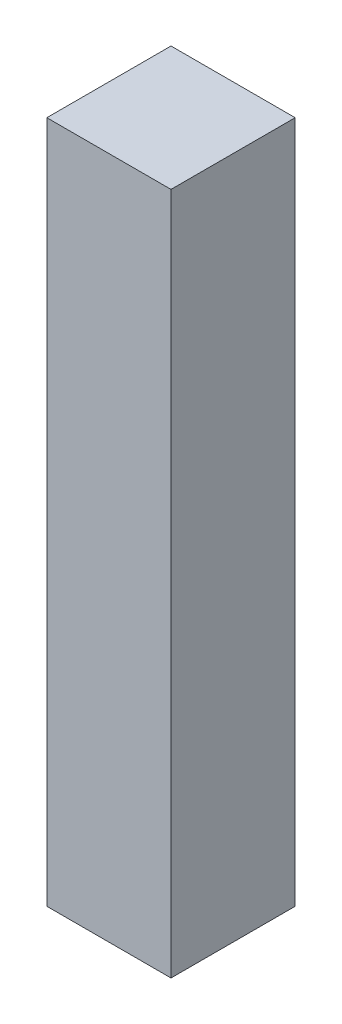
ISO-10303-21;
HEADER;
FILE_DESCRIPTION(('STEP AP214'),'2;1');
FILE_NAME('part.step','',(''),(''),'','','');
FILE_SCHEMA(('AUTOMOTIVE_DESIGN { 1 0 10303 214 1 1 1 1 }'));
ENDSEC;
DATA;
#1=APPLICATION_CONTEXT('core data for automotive mechanical design processes');
#2=APPLICATION_PROTOCOL_DEFINITION('international standard','automotive_design',2000,#1);
#3=PRODUCT_CONTEXT('',#1,'mechanical');
#4=PRODUCT('Part','Part','',(#3));
#5=PRODUCT_RELATED_PRODUCT_CATEGORY('part','',(#4));
#6=PRODUCT_DEFINITION_FORMATION('','',#4);
#7=PRODUCT_DEFINITION_CONTEXT('part definition',#1,'design');
#8=PRODUCT_DEFINITION('design','',#6,#7);
#9=PRODUCT_DEFINITION_SHAPE('','',#8);
#10=(LENGTH_UNIT() NAMED_UNIT(*) SI_UNIT(.MILLI.,.METRE.));
#11=(NAMED_UNIT(*) PLANE_ANGLE_UNIT() SI_UNIT($,.RADIAN.));
#12=(NAMED_UNIT(*) SI_UNIT($,.STERADIAN.) SOLID_ANGLE_UNIT());
#13=UNCERTAINTY_MEASURE_WITH_UNIT(LENGTH_MEASURE(1.E-05),#10,'distance_accuracy_value','');
#14=(GEOMETRIC_REPRESENTATION_CONTEXT(3) GLOBAL_UNCERTAINTY_ASSIGNED_CONTEXT((#13)) GLOBAL_UNIT_ASSIGNED_CONTEXT((#10,
#11,#12)) REPRESENTATION_CONTEXT('',''));
#15=CARTESIAN_POINT('',(0.,0.,0.));
#16=DIRECTION('',(0.,0.,1.));
#17=DIRECTION('',(1.,0.,0.));
#18=AXIS2_PLACEMENT_3D('',#15,#16,#17);
#19=CARTESIAN_POINT('',(50.,550.,50.));
#20=DIRECTION('',(-1.,0.,0.));
#21=DIRECTION('',(0.,0.,1.));
#22=AXIS2_PLACEMENT_3D('',#19,#20,#21);
#23=PLANE('',#22);
#24=DIRECTION('',(0.,0.,-1.));
#25=VECTOR('',#24,1.);
#26=CARTESIAN_POINT('',(50.,0.,50.));
#27=LINE('',#26,#25);
#28=CARTESIAN_POINT('',(50.,0.,50.));
#29=VERTEX_POINT('',#28);
#30=CARTESIAN_POINT('',(50.,0.,-50.));
#31=VERTEX_POINT('',#30);
#32=EDGE_CURVE('E97',#29,#31,#27,.T.);
#33=ORIENTED_EDGE('',*,*,#32,.T.);
#34=DIRECTION('',(0.,-1.,0.));
#35=VECTOR('',#34,1.);
#36=CARTESIAN_POINT('',(50.,550.,-50.));
#37=LINE('',#36,#35);
#38=CARTESIAN_POINT('',(50.,550.,-50.));
#39=VERTEX_POINT('',#38);
#40=EDGE_CURVE('E11',#39,#31,#37,.T.);
#41=ORIENTED_EDGE('',*,*,#40,.F.);
#42=DIRECTION('',(0.,0.,-1.));
#43=VECTOR('',#42,1.);
#44=CARTESIAN_POINT('',(50.,550.,50.));
#45=LINE('',#44,#43);
#46=CARTESIAN_POINT('',(50.,550.,50.));
#47=VERTEX_POINT('',#46);
#48=EDGE_CURVE('E85',#47,#39,#45,.T.);
#49=ORIENTED_EDGE('',*,*,#48,.F.);
#50=DIRECTION('',(0.,-1.,0.));
#51=VECTOR('',#50,1.);
#52=CARTESIAN_POINT('',(50.,550.,50.));
#53=LINE('',#52,#51);
#54=EDGE_CURVE('E93',#47,#29,#53,.T.);
#55=ORIENTED_EDGE('',*,*,#54,.T.);
#56=EDGE_LOOP('',(#33,#41,#49,#55));
#57=FACE_BOUND('',#56,.T.);
#58=ADVANCED_FACE('F34',(#57),#23,.F.);
#59=CARTESIAN_POINT('',(-50.,550.,-50.));
#60=DIRECTION('',(0.,0.,1.));
#61=DIRECTION('',(1.,0.,0.));
#62=AXIS2_PLACEMENT_3D('',#59,#60,#61);
#63=PLANE('',#62);
#64=DIRECTION('',(-1.,0.,0.));
#65=VECTOR('',#64,1.);
#66=CARTESIAN_POINT('',(-50.,0.,-50.));
#67=LINE('',#66,#65);
#68=CARTESIAN_POINT('',(-50.,0.,-50.));
#69=VERTEX_POINT('',#68);
#70=EDGE_CURVE('E89',#31,#69,#67,.T.);
#71=ORIENTED_EDGE('',*,*,#70,.T.);
#72=DIRECTION('',(0.,-1.,0.));
#73=VECTOR('',#72,1.);
#74=CARTESIAN_POINT('',(-50.,550.,-50.));
#75=LINE('',#74,#73);
#76=CARTESIAN_POINT('',(-50.,550.,-50.));
#77=VERTEX_POINT('',#76);
#78=EDGE_CURVE('E42',#77,#69,#75,.T.);
#79=ORIENTED_EDGE('',*,*,#78,.F.);
#80=DIRECTION('',(-1.,0.,0.));
#81=VECTOR('',#80,1.);
#82=CARTESIAN_POINT('',(-50.,550.,-50.));
#83=LINE('',#82,#81);
#84=EDGE_CURVE('E80',#39,#77,#83,.T.);
#85=ORIENTED_EDGE('',*,*,#84,.F.);
#86=ORIENTED_EDGE('',*,*,#40,.T.);
#87=EDGE_LOOP('',(#71,#79,#85,#86));
#88=FACE_BOUND('',#87,.T.);
#89=ADVANCED_FACE('F88',(#88),#63,.F.);
#90=CARTESIAN_POINT('',(-50.,550.,50.));
#91=DIRECTION('',(1.,0.,0.));
#92=DIRECTION('',(0.,0.,-1.));
#93=AXIS2_PLACEMENT_3D('',#90,#91,#92);
#94=PLANE('',#93);
#95=DIRECTION('',(0.,0.,1.));
#96=VECTOR('',#95,1.);
#97=CARTESIAN_POINT('',(-50.,0.,50.));
#98=LINE('',#97,#96);
#99=CARTESIAN_POINT('',(-50.,0.,50.));
#100=VERTEX_POINT('',#99);
#101=EDGE_CURVE('E67',#69,#100,#98,.T.);
#102=ORIENTED_EDGE('',*,*,#101,.T.);
#103=DIRECTION('',(0.,-1.,0.));
#104=VECTOR('',#103,1.);
#105=CARTESIAN_POINT('',(-50.,550.,50.));
#106=LINE('',#105,#104);
#107=CARTESIAN_POINT('',(-50.,550.,50.));
#108=VERTEX_POINT('',#107);
#109=EDGE_CURVE('E90',#108,#100,#106,.T.);
#110=ORIENTED_EDGE('',*,*,#109,.F.);
#111=DIRECTION('',(0.,0.,1.));
#112=VECTOR('',#111,1.);
#113=CARTESIAN_POINT('',(-50.,550.,50.));
#114=LINE('',#113,#112);
#115=EDGE_CURVE('E83',#77,#108,#114,.T.);
#116=ORIENTED_EDGE('',*,*,#115,.F.);
#117=ORIENTED_EDGE('',*,*,#78,.T.);
#118=EDGE_LOOP('',(#102,#110,#116,#117));
#119=FACE_BOUND('',#118,.T.);
#120=ADVANCED_FACE('F91',(#119),#94,.F.);
#121=CARTESIAN_POINT('',(-50.,550.,50.));
#122=DIRECTION('',(0.,0.,-1.));
#123=DIRECTION('',(-1.,0.,0.));
#124=AXIS2_PLACEMENT_3D('',#121,#122,#123);
#125=PLANE('',#124);
#126=DIRECTION('',(1.,0.,0.));
#127=VECTOR('',#126,1.);
#128=CARTESIAN_POINT('',(-50.,0.,50.));
#129=LINE('',#128,#127);
#130=EDGE_CURVE('E73',#100,#29,#129,.T.);
#131=ORIENTED_EDGE('',*,*,#130,.T.);
#132=ORIENTED_EDGE('',*,*,#54,.F.);
#133=DIRECTION('',(1.,0.,0.));
#134=VECTOR('',#133,1.);
#135=CARTESIAN_POINT('',(-50.,550.,50.));
#136=LINE('',#135,#134);
#137=EDGE_CURVE('E50',#108,#47,#136,.T.);
#138=ORIENTED_EDGE('',*,*,#137,.F.);
#139=ORIENTED_EDGE('',*,*,#109,.T.);
#140=EDGE_LOOP('',(#131,#132,#138,#139));
#141=FACE_BOUND('',#140,.T.);
#142=ADVANCED_FACE('F104',(#141),#125,.F.);
#143=CARTESIAN_POINT('',(0.,550.,0.));
#144=DIRECTION('',(0.,-1.,0.));
#145=DIRECTION('',(0.,0.,-1.));
#146=AXIS2_PLACEMENT_3D('',#143,#144,#145);
#147=PLANE('',#146);
#148=ORIENTED_EDGE('',*,*,#48,.T.);
#149=ORIENTED_EDGE('',*,*,#84,.T.);
#150=ORIENTED_EDGE('',*,*,#115,.T.);
#151=ORIENTED_EDGE('',*,*,#137,.T.);
#152=EDGE_LOOP('',(#148,#149,#150,#151));
#153=FACE_BOUND('',#152,.T.);
#154=ADVANCED_FACE('F81',(#153),#147,.F.);
#155=CARTESIAN_POINT('',(0.,0.,0.));
#156=DIRECTION('',(0.,-1.,0.));
#157=DIRECTION('',(0.,0.,-1.));
#158=AXIS2_PLACEMENT_3D('',#155,#156,#157);
#159=PLANE('',#158);
#160=ORIENTED_EDGE('',*,*,#32,.F.);
#161=ORIENTED_EDGE('',*,*,#130,.F.);
#162=ORIENTED_EDGE('',*,*,#101,.F.);
#163=ORIENTED_EDGE('',*,*,#70,.F.);
#164=EDGE_LOOP('',(#160,#161,#162,#163));
#165=FACE_BOUND('',#164,.T.);
#166=ADVANCED_FACE('F107',(#165),#159,.T.);
#167=CLOSED_SHELL('',(#58,#89,#120,#142,#154,#166));
#168=MANIFOLD_SOLID_BREP('B2',#167);
#169=ADVANCED_BREP_SHAPE_REPRESENTATION('',(#18,#168),#14);
#170=SHAPE_DEFINITION_REPRESENTATION(#9,#169);
ENDSEC;
END-ISO-10303-21;
